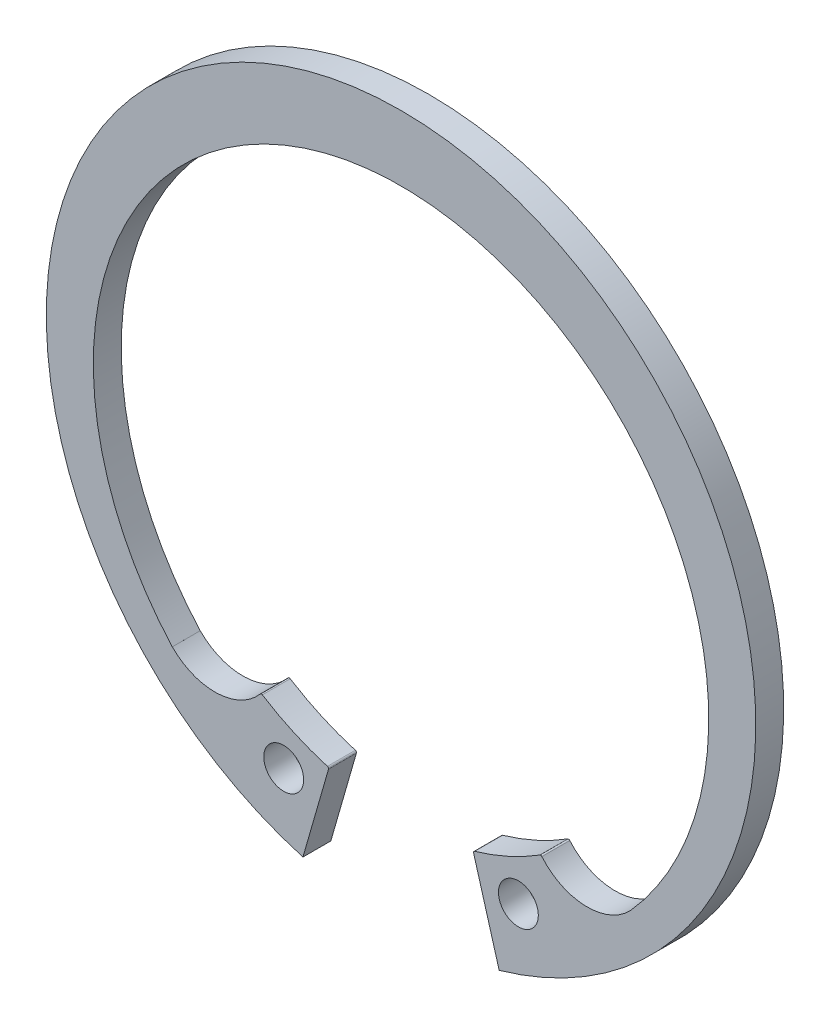
ISO-10303-21;
HEADER;
FILE_DESCRIPTION(('STEP AP214'),'2;1');
FILE_NAME('part.step','',(''),(''),'','','');
FILE_SCHEMA(('AUTOMOTIVE_DESIGN { 1 0 10303 214 1 1 1 1 }'));
ENDSEC;
DATA;
#1=APPLICATION_CONTEXT('core data for automotive mechanical design processes');
#2=APPLICATION_PROTOCOL_DEFINITION('international standard','automotive_design',2000,#1);
#3=PRODUCT_CONTEXT('',#1,'mechanical');
#4=PRODUCT('Part','Part','',(#3));
#5=PRODUCT_RELATED_PRODUCT_CATEGORY('part','',(#4));
#6=PRODUCT_DEFINITION_FORMATION('','',#4);
#7=PRODUCT_DEFINITION_CONTEXT('part definition',#1,'design');
#8=PRODUCT_DEFINITION('design','',#6,#7);
#9=PRODUCT_DEFINITION_SHAPE('','',#8);
#10=(LENGTH_UNIT() NAMED_UNIT(*) SI_UNIT(.MILLI.,.METRE.));
#11=(NAMED_UNIT(*) PLANE_ANGLE_UNIT() SI_UNIT($,.RADIAN.));
#12=(NAMED_UNIT(*) SI_UNIT($,.STERADIAN.) SOLID_ANGLE_UNIT());
#13=UNCERTAINTY_MEASURE_WITH_UNIT(LENGTH_MEASURE(1.E-05),#10,'distance_accuracy_value','');
#14=(GEOMETRIC_REPRESENTATION_CONTEXT(3) GLOBAL_UNCERTAINTY_ASSIGNED_CONTEXT((#13)) GLOBAL_UNIT_ASSIGNED_CONTEXT((#10,
#11,#12)) REPRESENTATION_CONTEXT('',''));
#15=CARTESIAN_POINT('',(0.,0.,0.));
#16=DIRECTION('',(0.,0.,1.));
#17=DIRECTION('',(1.,0.,0.));
#18=AXIS2_PLACEMENT_3D('',#15,#16,#17);
#19=CARTESIAN_POINT('',(0.,0.,-1.75));
#20=DIRECTION('',(0.,0.,1.));
#21=DIRECTION('',(1.,0.,0.));
#22=AXIS2_PLACEMENT_3D('',#19,#20,#21);
#23=CYLINDRICAL_SURFACE('',#22,22.25);
#24=CARTESIAN_POINT('',(0.,0.,-1.75));
#25=DIRECTION('',(0.,0.,1.));
#26=DIRECTION('',(1.,0.,0.));
#27=AXIS2_PLACEMENT_3D('',#24,#25,#26);
#28=CIRCLE('',#27,22.25);
#29=CARTESIAN_POINT('',(6.15473831044329,-21.3818076020238,-1.75));
#30=VERTEX_POINT('',#29);
#31=CARTESIAN_POINT('',(-6.15473831044329,-21.3818076020238,-1.75));
#32=VERTEX_POINT('',#31);
#33=EDGE_CURVE('E48',#30,#32,#28,.T.);
#34=ORIENTED_EDGE('',*,*,#33,.T.);
#35=DIRECTION('',(0.,0.,1.));
#36=VECTOR('',#35,1.);
#37=CARTESIAN_POINT('',(-6.15473831044329,-21.3818076020238,-1.75));
#38=LINE('',#37,#36);
#39=CARTESIAN_POINT('',(-6.15473831044329,-21.3818076020238,0.));
#40=VERTEX_POINT('',#39);
#41=EDGE_CURVE('E35',#32,#40,#38,.T.);
#42=ORIENTED_EDGE('',*,*,#41,.T.);
#43=CARTESIAN_POINT('',(0.,0.,0.));
#44=DIRECTION('',(0.,0.,1.));
#45=DIRECTION('',(1.,0.,0.));
#46=AXIS2_PLACEMENT_3D('',#43,#44,#45);
#47=CIRCLE('',#46,22.25);
#48=CARTESIAN_POINT('',(6.15473831044329,-21.3818076020238,0.));
#49=VERTEX_POINT('',#48);
#50=EDGE_CURVE('E137',#49,#40,#47,.T.);
#51=ORIENTED_EDGE('',*,*,#50,.F.);
#52=DIRECTION('',(0.,0.,1.));
#53=VECTOR('',#52,1.);
#54=CARTESIAN_POINT('',(6.15473831044329,-21.3818076020238,-1.75));
#55=LINE('',#54,#53);
#56=EDGE_CURVE('E11',#30,#49,#55,.T.);
#57=ORIENTED_EDGE('',*,*,#56,.F.);
#58=EDGE_LOOP('',(#34,#42,#51,#57));
#59=FACE_BOUND('',#58,.T.);
#60=ADVANCED_FACE('F32',(#59),#23,.T.);
#61=CARTESIAN_POINT('',(6.15473831044329,-21.3818076020238,-1.75));
#62=DIRECTION('',(-0.960980116944889,-0.276617452154754,0.));
#63=DIRECTION('',(0.276617452154754,-0.960980116944889,0.));
#64=AXIS2_PLACEMENT_3D('',#61,#62,#63);
#65=PLANE('',#64);
#66=DIRECTION('',(0.276617452154754,-0.960980116944889,0.));
#67=VECTOR('',#66,1.);
#68=CARTESIAN_POINT('',(6.15473831044329,-21.3818076020238,0.));
#69=LINE('',#68,#67);
#70=CARTESIAN_POINT('',(4.55027300891599,-15.8078308298239,0.));
#71=VERTEX_POINT('',#70);
#72=EDGE_CURVE('E245',#71,#49,#69,.T.);
#73=ORIENTED_EDGE('',*,*,#72,.F.);
#74=DIRECTION('',(0.,0.,1.));
#75=VECTOR('',#74,1.);
#76=CARTESIAN_POINT('',(4.55027300891599,-15.8078308298239,-1.75));
#77=LINE('',#76,#75);
#78=CARTESIAN_POINT('',(4.55027300891599,-15.8078308298239,-1.75));
#79=VERTEX_POINT('',#78);
#80=EDGE_CURVE('E215',#79,#71,#77,.T.);
#81=ORIENTED_EDGE('',*,*,#80,.F.);
#82=DIRECTION('',(0.276617452154754,-0.960980116944889,0.));
#83=VECTOR('',#82,1.);
#84=CARTESIAN_POINT('',(6.15473831044329,-21.3818076020238,-1.75));
#85=LINE('',#84,#83);
#86=EDGE_CURVE('E251',#79,#30,#85,.T.);
#87=ORIENTED_EDGE('',*,*,#86,.T.);
#88=ORIENTED_EDGE('',*,*,#56,.T.);
#89=EDGE_LOOP('',(#73,#81,#87,#88));
#90=FACE_BOUND('',#89,.T.);
#91=ADVANCED_FACE('F300',(#90),#65,.T.);
#92=CARTESIAN_POINT('',(0.,-1.15100936737794,-1.75));
#93=DIRECTION('',(0.,0.,1.));
#94=DIRECTION('',(1.,0.,0.));
#95=AXIS2_PLACEMENT_3D('',#92,#93,#94);
#96=CYLINDRICAL_SURFACE('',#95,19.3010093673779);
#97=DIRECTION('',(0.,0.,1.));
#98=VECTOR('',#97,1.);
#99=CARTESIAN_POINT('',(-14.3481426053221,-14.0606866048984,-1.75));
#100=LINE('',#99,#98);
#101=CARTESIAN_POINT('',(-14.3481426053221,-14.0606866048984,-1.75));
#102=VERTEX_POINT('',#101);
#103=CARTESIAN_POINT('',(-14.3481426053221,-14.0606866048984,0.));
#104=VERTEX_POINT('',#103);
#105=EDGE_CURVE('E180',#102,#104,#100,.T.);
#106=ORIENTED_EDGE('',*,*,#105,.F.);
#107=CARTESIAN_POINT('',(0.,-1.15100936737794,-1.75));
#108=DIRECTION('',(0.,0.,-1.));
#109=DIRECTION('',(1.,0.,0.));
#110=AXIS2_PLACEMENT_3D('',#107,#108,#109);
#111=CIRCLE('',#110,19.3010093673779);
#112=CARTESIAN_POINT('',(14.3481426053221,-14.0606866048984,-1.75));
#113=VERTEX_POINT('',#112);
#114=EDGE_CURVE('E249',#102,#113,#111,.T.);
#115=ORIENTED_EDGE('',*,*,#114,.T.);
#116=DIRECTION('',(0.,0.,1.));
#117=VECTOR('',#116,1.);
#118=CARTESIAN_POINT('',(14.3481426053221,-14.0606866048984,-1.75));
#119=LINE('',#118,#117);
#120=CARTESIAN_POINT('',(14.3481426053221,-14.0606866048984,0.));
#121=VERTEX_POINT('',#120);
#122=EDGE_CURVE('E218',#121,#113,#119,.F.);
#123=ORIENTED_EDGE('',*,*,#122,.F.);
#124=CARTESIAN_POINT('',(0.,-1.15100936737794,0.));
#125=DIRECTION('',(0.,0.,-1.));
#126=DIRECTION('',(1.,0.,0.));
#127=AXIS2_PLACEMENT_3D('',#124,#125,#126);
#128=CIRCLE('',#127,19.3010093673779);
#129=EDGE_CURVE('E139',#104,#121,#128,.T.);
#130=ORIENTED_EDGE('',*,*,#129,.F.);
#131=EDGE_LOOP('',(#106,#115,#123,#130));
#132=FACE_BOUND('',#131,.T.);
#133=ADVANCED_FACE('F279',(#132),#96,.F.);
#134=CARTESIAN_POINT('',(-6.15473831044329,-21.3818076020238,-1.75));
#135=DIRECTION('',(0.960980116944889,-0.276617452154755,0.));
#136=DIRECTION('',(0.276617452154755,0.960980116944889,0.));
#137=AXIS2_PLACEMENT_3D('',#134,#135,#136);
#138=PLANE('',#137);
#139=DIRECTION('',(0.276617452154755,0.960980116944889,0.));
#140=VECTOR('',#139,1.);
#141=CARTESIAN_POINT('',(-6.15473831044329,-21.3818076020238,0.));
#142=LINE('',#141,#140);
#143=CARTESIAN_POINT('',(-4.55027300891599,-15.8078308298239,0.));
#144=VERTEX_POINT('',#143);
#145=EDGE_CURVE('E129',#40,#144,#142,.T.);
#146=ORIENTED_EDGE('',*,*,#145,.F.);
#147=ORIENTED_EDGE('',*,*,#41,.F.);
#148=DIRECTION('',(0.276617452154755,0.960980116944889,0.));
#149=VECTOR('',#148,1.);
#150=CARTESIAN_POINT('',(-6.15473831044329,-21.3818076020238,-1.75));
#151=LINE('',#150,#149);
#152=CARTESIAN_POINT('',(-4.55027300891599,-15.8078308298239,-1.75));
#153=VERTEX_POINT('',#152);
#154=EDGE_CURVE('E145',#32,#153,#151,.T.);
#155=ORIENTED_EDGE('',*,*,#154,.T.);
#156=DIRECTION('',(0.,0.,1.));
#157=VECTOR('',#156,1.);
#158=CARTESIAN_POINT('',(-4.55027300891599,-15.8078308298239,-1.75));
#159=LINE('',#158,#157);
#160=EDGE_CURVE('E142',#153,#144,#159,.T.);
#161=ORIENTED_EDGE('',*,*,#160,.T.);
#162=EDGE_LOOP('',(#146,#147,#155,#161));
#163=FACE_BOUND('',#162,.T.);
#164=ADVANCED_FACE('F143',(#163),#138,.T.);
#165=CARTESIAN_POINT('',(0.,0.,-1.75));
#166=DIRECTION('',(0.,0.,1.));
#167=DIRECTION('',(1.,0.,0.));
#168=AXIS2_PLACEMENT_3D('',#165,#166,#167);
#169=PLANE('',#168);
#170=ORIENTED_EDGE('',*,*,#114,.F.);
#171=DIRECTION('',(-0.714225110552972,-0.699916060292658,0.));
#172=VECTOR('',#171,1.);
#173=CARTESIAN_POINT('',(-15.8915087098036,-15.5731323415116,-1.75));
#174=LINE('',#173,#172);
#175=CARTESIAN_POINT('',(-14.3451372472455,-14.057741457278,-1.75));
#176=VERTEX_POINT('',#175);
#177=EDGE_CURVE('E150',#176,#102,#174,.T.);
#178=ORIENTED_EDGE('',*,*,#177,.F.);
#179=CARTESIAN_POINT('',(-11.6775805575411,-11.4436275857849,-1.75));
#180=DIRECTION('',(0.,0.,-1.));
#181=DIRECTION('',(1.,0.,0.));
#182=AXIS2_PLACEMENT_3D('',#179,#180,#181);
#183=CIRCLE('',#182,3.73489625370228);
#184=CARTESIAN_POINT('',(-8.83127616096119,-13.8618916962429,-1.75));
#185=VERTEX_POINT('',#184);
#186=EDGE_CURVE('E174',#185,#176,#183,.T.);
#187=ORIENTED_EDGE('',*,*,#186,.F.);
#188=CARTESIAN_POINT('',(-8.75506776845876,-13.9266395217832,-1.75));
#189=DIRECTION('',(0.,0.,1.));
#190=DIRECTION('',(1.,0.,0.));
#191=AXIS2_PLACEMENT_3D('',#188,#189,#190);
#192=CIRCLE('',#191,0.1);
#193=CARTESIAN_POINT('',(-8.70184547199397,-13.8419790991584,-1.75));
#194=VERTEX_POINT('',#193);
#195=EDGE_CURVE('E171',#194,#185,#192,.T.);
#196=ORIENTED_EDGE('',*,*,#195,.F.);
#197=CARTESIAN_POINT('',(0.,0.,-1.75));
#198=DIRECTION('',(0.,0.,-1.));
#199=DIRECTION('',(1.,0.,0.));
#200=AXIS2_PLACEMENT_3D('',#197,#198,#199);
#201=CIRCLE('',#200,16.35);
#202=CARTESIAN_POINT('',(-4.61812560407181,-15.6842410050667,-1.75));
#203=VERTEX_POINT('',#202);
#204=EDGE_CURVE('E169',#203,#194,#201,.T.);
#205=ORIENTED_EDGE('',*,*,#204,.F.);
#206=CARTESIAN_POINT('',(-4.64637102061048,-15.7801690846084,-1.75));
#207=DIRECTION('',(0.,0.,1.));
#208=DIRECTION('',(-1.,0.,0.));
#209=AXIS2_PLACEMENT_3D('',#206,#207,#208);
#210=CIRCLE('',#209,0.0999999999999959);
#211=EDGE_CURVE('E167',#153,#203,#210,.T.);
#212=ORIENTED_EDGE('',*,*,#211,.F.);
#213=ORIENTED_EDGE('',*,*,#154,.F.);
#214=ORIENTED_EDGE('',*,*,#33,.F.);
#215=ORIENTED_EDGE('',*,*,#86,.F.);
#216=CARTESIAN_POINT('',(4.64637102061048,-15.7801690846084,-1.75));
#217=DIRECTION('',(0.,0.,1.));
#218=DIRECTION('',(1.,0.,0.));
#219=AXIS2_PLACEMENT_3D('',#216,#217,#218);
#220=CIRCLE('',#219,0.0999999999999972);
#221=CARTESIAN_POINT('',(4.61812560407181,-15.6842410050667,-1.75));
#222=VERTEX_POINT('',#221);
#223=EDGE_CURVE('E211',#222,#79,#220,.T.);
#224=ORIENTED_EDGE('',*,*,#223,.F.);
#225=CARTESIAN_POINT('',(0.,0.,-1.75));
#226=DIRECTION('',(0.,0.,-1.));
#227=DIRECTION('',(1.,0.,0.));
#228=AXIS2_PLACEMENT_3D('',#225,#226,#227);
#229=CIRCLE('',#228,16.35);
#230=CARTESIAN_POINT('',(8.70184547199397,-13.8419790991584,-1.75));
#231=VERTEX_POINT('',#230);
#232=EDGE_CURVE('E209',#231,#222,#229,.T.);
#233=ORIENTED_EDGE('',*,*,#232,.F.);
#234=CARTESIAN_POINT('',(8.75506776845876,-13.9266395217832,-1.75));
#235=DIRECTION('',(0.,0.,1.));
#236=DIRECTION('',(-1.,0.,0.));
#237=AXIS2_PLACEMENT_3D('',#234,#235,#236);
#238=CIRCLE('',#237,0.1);
#239=CARTESIAN_POINT('',(8.83127616096119,-13.8618916962429,-1.75));
#240=VERTEX_POINT('',#239);
#241=EDGE_CURVE('E206',#240,#231,#238,.T.);
#242=ORIENTED_EDGE('',*,*,#241,.F.);
#243=CARTESIAN_POINT('',(11.6775805575411,-11.4436275857849,-1.75));
#244=DIRECTION('',(0.,0.,-1.));
#245=DIRECTION('',(1.,0.,0.));
#246=AXIS2_PLACEMENT_3D('',#243,#244,#245);
#247=CIRCLE('',#246,3.73489625370228);
#248=CARTESIAN_POINT('',(14.3451372472455,-14.057741457278,-1.75));
#249=VERTEX_POINT('',#248);
#250=EDGE_CURVE('E203',#249,#240,#247,.T.);
#251=ORIENTED_EDGE('',*,*,#250,.F.);
#252=DIRECTION('',(-0.714225110552972,0.699916060292658,0.));
#253=VECTOR('',#252,1.);
#254=CARTESIAN_POINT('',(14.3451372472455,-14.057741457278,-1.75));
#255=LINE('',#254,#253);
#256=EDGE_CURVE('E201',#113,#249,#255,.T.);
#257=ORIENTED_EDGE('',*,*,#256,.F.);
#258=EDGE_LOOP('',(#170,#178,#187,#196,#205,#212,#213,#214,#215,#224,#233,#242,#251,#257));
#259=FACE_BOUND('',#258,.T.);
#260=CARTESIAN_POINT('',(7.35991880160462,-17.163543347275,-1.75));
#261=DIRECTION('',(0.,0.,1.));
#262=DIRECTION('',(1.,0.,0.));
#263=AXIS2_PLACEMENT_3D('',#260,#261,#262);
#264=CIRCLE('',#263,1.25);
#265=CARTESIAN_POINT('',(8.60991880160462,-17.163543347275,-1.75));
#266=VERTEX_POINT('',#265);
#267=EDGE_CURVE('E240',#266,#266,#264,.T.);
#268=ORIENTED_EDGE('',*,*,#267,.T.);
#269=EDGE_LOOP('',(#268));
#270=FACE_BOUND('',#269,.T.);
#271=CARTESIAN_POINT('',(-7.35991880160461,-17.163543347275,-1.75));
#272=DIRECTION('',(0.,0.,1.));
#273=DIRECTION('',(1.,0.,0.));
#274=AXIS2_PLACEMENT_3D('',#271,#272,#273);
#275=CIRCLE('',#274,1.25);
#276=CARTESIAN_POINT('',(-6.10991880160461,-17.163543347275,-1.75));
#277=VERTEX_POINT('',#276);
#278=EDGE_CURVE('E234',#277,#277,#275,.T.);
#279=ORIENTED_EDGE('',*,*,#278,.T.);
#280=EDGE_LOOP('',(#279));
#281=FACE_BOUND('',#280,.T.);
#282=ADVANCED_FACE('F257',(#259,#270,#281),#169,.F.);
#283=CARTESIAN_POINT('',(0.,0.,0.));
#284=DIRECTION('',(0.,0.,1.));
#285=DIRECTION('',(1.,0.,0.));
#286=AXIS2_PLACEMENT_3D('',#283,#284,#285);
#287=PLANE('',#286);
#288=DIRECTION('',(-0.714225110552972,-0.699916060292658,0.));
#289=VECTOR('',#288,1.);
#290=CARTESIAN_POINT('',(-15.8915087098036,-15.5731323415116,0.));
#291=LINE('',#290,#289);
#292=CARTESIAN_POINT('',(-14.3451372472455,-14.057741457278,0.));
#293=VERTEX_POINT('',#292);
#294=EDGE_CURVE('E165',#293,#104,#291,.T.);
#295=ORIENTED_EDGE('',*,*,#294,.T.);
#296=ORIENTED_EDGE('',*,*,#129,.T.);
#297=DIRECTION('',(-0.714225110552972,0.699916060292658,0.));
#298=VECTOR('',#297,1.);
#299=CARTESIAN_POINT('',(14.3451372472455,-14.057741457278,0.));
#300=LINE('',#299,#298);
#301=CARTESIAN_POINT('',(14.3451372472455,-14.057741457278,0.));
#302=VERTEX_POINT('',#301);
#303=EDGE_CURVE('E188',#121,#302,#300,.T.);
#304=ORIENTED_EDGE('',*,*,#303,.T.);
#305=CARTESIAN_POINT('',(11.6775805575411,-11.4436275857849,0.));
#306=DIRECTION('',(0.,0.,-1.));
#307=DIRECTION('',(1.,0.,0.));
#308=AXIS2_PLACEMENT_3D('',#305,#306,#307);
#309=CIRCLE('',#308,3.73489625370228);
#310=CARTESIAN_POINT('',(8.83127616096119,-13.8618916962429,0.));
#311=VERTEX_POINT('',#310);
#312=EDGE_CURVE('E190',#302,#311,#309,.T.);
#313=ORIENTED_EDGE('',*,*,#312,.T.);
#314=CARTESIAN_POINT('',(8.75506776845876,-13.9266395217832,0.));
#315=DIRECTION('',(0.,0.,1.));
#316=DIRECTION('',(-1.,0.,0.));
#317=AXIS2_PLACEMENT_3D('',#314,#315,#316);
#318=CIRCLE('',#317,0.1);
#319=CARTESIAN_POINT('',(8.70184547199397,-13.8419790991584,0.));
#320=VERTEX_POINT('',#319);
#321=EDGE_CURVE('E193',#311,#320,#318,.T.);
#322=ORIENTED_EDGE('',*,*,#321,.T.);
#323=CARTESIAN_POINT('',(0.,0.,0.));
#324=DIRECTION('',(0.,0.,-1.));
#325=DIRECTION('',(1.,0.,0.));
#326=AXIS2_PLACEMENT_3D('',#323,#324,#325);
#327=CIRCLE('',#326,16.35);
#328=CARTESIAN_POINT('',(4.61812560407181,-15.6842410050667,0.));
#329=VERTEX_POINT('',#328);
#330=EDGE_CURVE('E196',#320,#329,#327,.T.);
#331=ORIENTED_EDGE('',*,*,#330,.T.);
#332=CARTESIAN_POINT('',(4.64637102061048,-15.7801690846084,0.));
#333=DIRECTION('',(0.,0.,1.));
#334=DIRECTION('',(1.,0.,0.));
#335=AXIS2_PLACEMENT_3D('',#332,#333,#334);
#336=CIRCLE('',#335,0.0999999999999972);
#337=EDGE_CURVE('E198',#329,#71,#336,.T.);
#338=ORIENTED_EDGE('',*,*,#337,.T.);
#339=ORIENTED_EDGE('',*,*,#72,.T.);
#340=ORIENTED_EDGE('',*,*,#50,.T.);
#341=ORIENTED_EDGE('',*,*,#145,.T.);
#342=CARTESIAN_POINT('',(-4.64637102061048,-15.7801690846084,0.));
#343=DIRECTION('',(0.,0.,1.));
#344=DIRECTION('',(-1.,0.,0.));
#345=AXIS2_PLACEMENT_3D('',#342,#343,#344);
#346=CIRCLE('',#345,0.0999999999999959);
#347=CARTESIAN_POINT('',(-4.61812560407181,-15.6842410050667,0.));
#348=VERTEX_POINT('',#347);
#349=EDGE_CURVE('E135',#144,#348,#346,.T.);
#350=ORIENTED_EDGE('',*,*,#349,.T.);
#351=CARTESIAN_POINT('',(0.,0.,0.));
#352=DIRECTION('',(0.,0.,-1.));
#353=DIRECTION('',(1.,0.,0.));
#354=AXIS2_PLACEMENT_3D('',#351,#352,#353);
#355=CIRCLE('',#354,16.35);
#356=CARTESIAN_POINT('',(-8.70184547199397,-13.8419790991584,0.));
#357=VERTEX_POINT('',#356);
#358=EDGE_CURVE('E155',#348,#357,#355,.T.);
#359=ORIENTED_EDGE('',*,*,#358,.T.);
#360=CARTESIAN_POINT('',(-8.75506776845876,-13.9266395217832,0.));
#361=DIRECTION('',(0.,0.,1.));
#362=DIRECTION('',(1.,0.,0.));
#363=AXIS2_PLACEMENT_3D('',#360,#361,#362);
#364=CIRCLE('',#363,0.1);
#365=CARTESIAN_POINT('',(-8.83127616096119,-13.8618916962429,0.));
#366=VERTEX_POINT('',#365);
#367=EDGE_CURVE('E157',#357,#366,#364,.T.);
#368=ORIENTED_EDGE('',*,*,#367,.T.);
#369=CARTESIAN_POINT('',(-11.6775805575411,-11.4436275857849,0.));
#370=DIRECTION('',(0.,0.,-1.));
#371=DIRECTION('',(1.,0.,0.));
#372=AXIS2_PLACEMENT_3D('',#369,#370,#371);
#373=CIRCLE('',#372,3.73489625370228);
#374=EDGE_CURVE('E162',#366,#293,#373,.T.);
#375=ORIENTED_EDGE('',*,*,#374,.T.);
#376=EDGE_LOOP('',(#295,#296,#304,#313,#322,#331,#338,#339,#340,#341,#350,#359,#368,#375));
#377=FACE_BOUND('',#376,.T.);
#378=CARTESIAN_POINT('',(7.35991880160462,-17.163543347275,0.));
#379=DIRECTION('',(0.,0.,1.));
#380=DIRECTION('',(1.,0.,0.));
#381=AXIS2_PLACEMENT_3D('',#378,#379,#380);
#382=CIRCLE('',#381,1.25);
#383=CARTESIAN_POINT('',(8.60991880160462,-17.163543347275,0.));
#384=VERTEX_POINT('',#383);
#385=EDGE_CURVE('E237',#384,#384,#382,.T.);
#386=ORIENTED_EDGE('',*,*,#385,.F.);
#387=EDGE_LOOP('',(#386));
#388=FACE_BOUND('',#387,.T.);
#389=CARTESIAN_POINT('',(-7.35991880160461,-17.163543347275,0.));
#390=DIRECTION('',(0.,0.,1.));
#391=DIRECTION('',(1.,0.,0.));
#392=AXIS2_PLACEMENT_3D('',#389,#390,#391);
#393=CIRCLE('',#392,1.25);
#394=CARTESIAN_POINT('',(-6.10991880160461,-17.163543347275,0.));
#395=VERTEX_POINT('',#394);
#396=EDGE_CURVE('E231',#395,#395,#393,.T.);
#397=ORIENTED_EDGE('',*,*,#396,.F.);
#398=EDGE_LOOP('',(#397));
#399=FACE_BOUND('',#398,.T.);
#400=ADVANCED_FACE('F132',(#377,#388,#399),#287,.T.);
#401=CARTESIAN_POINT('',(7.35991880160462,-17.163543347275,-1.75));
#402=DIRECTION('',(0.,0.,1.));
#403=DIRECTION('',(1.,0.,0.));
#404=AXIS2_PLACEMENT_3D('',#401,#402,#403);
#405=CYLINDRICAL_SURFACE('',#404,1.25);
#406=ORIENTED_EDGE('',*,*,#267,.F.);
#407=EDGE_LOOP('',(#406));
#408=FACE_BOUND('',#407,.T.);
#409=ORIENTED_EDGE('',*,*,#385,.T.);
#410=EDGE_LOOP('',(#409));
#411=FACE_BOUND('',#410,.T.);
#412=ADVANCED_FACE('F317',(#408,#411),#405,.F.);
#413=CARTESIAN_POINT('',(-7.35991880160461,-17.163543347275,-1.75));
#414=DIRECTION('',(0.,0.,1.));
#415=DIRECTION('',(1.,0.,0.));
#416=AXIS2_PLACEMENT_3D('',#413,#414,#415);
#417=CYLINDRICAL_SURFACE('',#416,1.25);
#418=ORIENTED_EDGE('',*,*,#278,.F.);
#419=EDGE_LOOP('',(#418));
#420=FACE_BOUND('',#419,.T.);
#421=ORIENTED_EDGE('',*,*,#396,.T.);
#422=EDGE_LOOP('',(#421));
#423=FACE_BOUND('',#422,.T.);
#424=ADVANCED_FACE('F321',(#420,#423),#417,.F.);
#425=CARTESIAN_POINT('',(0.,0.,-1.75));
#426=DIRECTION('',(0.,0.,1.));
#427=DIRECTION('',(1.,0.,0.));
#428=AXIS2_PLACEMENT_3D('',#425,#426,#427);
#429=CYLINDRICAL_SURFACE('',#428,16.35);
#430=ORIENTED_EDGE('',*,*,#330,.F.);
#431=DIRECTION('',(0.,0.,1.));
#432=VECTOR('',#431,1.);
#433=CARTESIAN_POINT('',(8.70184547199397,-13.8419790991584,-1.75));
#434=LINE('',#433,#432);
#435=EDGE_CURVE('E222',#231,#320,#434,.T.);
#436=ORIENTED_EDGE('',*,*,#435,.F.);
#437=ORIENTED_EDGE('',*,*,#232,.T.);
#438=DIRECTION('',(0.,0.,1.));
#439=VECTOR('',#438,1.);
#440=CARTESIAN_POINT('',(4.61812560407181,-15.6842410050667,-1.75));
#441=LINE('',#440,#439);
#442=EDGE_CURVE('E219',#222,#329,#441,.T.);
#443=ORIENTED_EDGE('',*,*,#442,.T.);
#444=EDGE_LOOP('',(#430,#436,#437,#443));
#445=FACE_BOUND('',#444,.T.);
#446=ADVANCED_FACE('F294',(#445),#429,.F.);
#447=CARTESIAN_POINT('',(4.64637102061048,-15.7801690846084,-1.75));
#448=DIRECTION('',(0.,0.,1.));
#449=DIRECTION('',(1.,0.,0.));
#450=AXIS2_PLACEMENT_3D('',#447,#448,#449);
#451=CYLINDRICAL_SURFACE('',#450,0.0999999999999972);
#452=ORIENTED_EDGE('',*,*,#337,.F.);
#453=ORIENTED_EDGE('',*,*,#442,.F.);
#454=ORIENTED_EDGE('',*,*,#223,.T.);
#455=ORIENTED_EDGE('',*,*,#80,.T.);
#456=EDGE_LOOP('',(#452,#453,#454,#455));
#457=FACE_BOUND('',#456,.T.);
#458=ADVANCED_FACE('F299',(#457),#451,.T.);
#459=CARTESIAN_POINT('',(8.75506776845876,-13.9266395217832,-1.75));
#460=DIRECTION('',(0.,0.,1.));
#461=DIRECTION('',(1.,0.,0.));
#462=AXIS2_PLACEMENT_3D('',#459,#460,#461);
#463=CYLINDRICAL_SURFACE('',#462,0.1);
#464=ORIENTED_EDGE('',*,*,#321,.F.);
#465=DIRECTION('',(0.,0.,1.));
#466=VECTOR('',#465,1.);
#467=CARTESIAN_POINT('',(8.83127616096119,-13.8618916962429,-1.75));
#468=LINE('',#467,#466);
#469=EDGE_CURVE('E225',#240,#311,#468,.T.);
#470=ORIENTED_EDGE('',*,*,#469,.F.);
#471=ORIENTED_EDGE('',*,*,#241,.T.);
#472=ORIENTED_EDGE('',*,*,#435,.T.);
#473=EDGE_LOOP('',(#464,#470,#471,#472));
#474=FACE_BOUND('',#473,.T.);
#475=ADVANCED_FACE('F291',(#474),#463,.T.);
#476=CARTESIAN_POINT('',(11.6775805575411,-11.4436275857849,-1.75));
#477=DIRECTION('',(0.,0.,1.));
#478=DIRECTION('',(1.,0.,0.));
#479=AXIS2_PLACEMENT_3D('',#476,#477,#478);
#480=CYLINDRICAL_SURFACE('',#479,3.73489625370228);
#481=ORIENTED_EDGE('',*,*,#312,.F.);
#482=DIRECTION('',(0.,0.,1.));
#483=VECTOR('',#482,1.);
#484=CARTESIAN_POINT('',(14.3451372472455,-14.057741457278,-1.75));
#485=LINE('',#484,#483);
#486=EDGE_CURVE('E214',#249,#302,#485,.T.);
#487=ORIENTED_EDGE('',*,*,#486,.F.);
#488=ORIENTED_EDGE('',*,*,#250,.T.);
#489=ORIENTED_EDGE('',*,*,#469,.T.);
#490=EDGE_LOOP('',(#481,#487,#488,#489));
#491=FACE_BOUND('',#490,.T.);
#492=ADVANCED_FACE('F288',(#491),#480,.F.);
#493=CARTESIAN_POINT('',(14.3451372472455,-14.057741457278,-1.75));
#494=DIRECTION('',(0.699916060292658,0.714225110552972,0.));
#495=DIRECTION('',(-0.714225110552972,0.699916060292658,0.));
#496=AXIS2_PLACEMENT_3D('',#493,#494,#495);
#497=PLANE('',#496);
#498=ORIENTED_EDGE('',*,*,#303,.F.);
#499=ORIENTED_EDGE('',*,*,#122,.T.);
#500=ORIENTED_EDGE('',*,*,#256,.T.);
#501=ORIENTED_EDGE('',*,*,#486,.T.);
#502=EDGE_LOOP('',(#498,#499,#500,#501));
#503=FACE_BOUND('',#502,.T.);
#504=ADVANCED_FACE('F282',(#503),#497,.T.);
#505=CARTESIAN_POINT('',(0.,0.,-1.75));
#506=DIRECTION('',(0.,0.,1.));
#507=DIRECTION('',(1.,0.,0.));
#508=AXIS2_PLACEMENT_3D('',#505,#506,#507);
#509=CYLINDRICAL_SURFACE('',#508,16.35);
#510=ORIENTED_EDGE('',*,*,#358,.F.);
#511=DIRECTION('',(0.,0.,1.));
#512=VECTOR('',#511,1.);
#513=CARTESIAN_POINT('',(-4.61812560407181,-15.6842410050667,-1.75));
#514=LINE('',#513,#512);
#515=EDGE_CURVE('E149',#203,#348,#514,.T.);
#516=ORIENTED_EDGE('',*,*,#515,.F.);
#517=ORIENTED_EDGE('',*,*,#204,.T.);
#518=DIRECTION('',(0.,0.,1.));
#519=VECTOR('',#518,1.);
#520=CARTESIAN_POINT('',(-8.70184547199397,-13.8419790991584,-1.75));
#521=LINE('',#520,#519);
#522=EDGE_CURVE('E183',#194,#357,#521,.T.);
#523=ORIENTED_EDGE('',*,*,#522,.T.);
#524=EDGE_LOOP('',(#510,#516,#517,#523));
#525=FACE_BOUND('',#524,.T.);
#526=ADVANCED_FACE('F263',(#525),#509,.F.);
#527=CARTESIAN_POINT('',(-15.8915087098036,-15.5731323415116,-1.75));
#528=DIRECTION('',(-0.699916060292658,0.714225110552972,0.));
#529=DIRECTION('',(-0.714225110552972,-0.699916060292658,0.));
#530=AXIS2_PLACEMENT_3D('',#527,#528,#529);
#531=PLANE('',#530);
#532=ORIENTED_EDGE('',*,*,#177,.T.);
#533=ORIENTED_EDGE('',*,*,#105,.T.);
#534=ORIENTED_EDGE('',*,*,#294,.F.);
#535=DIRECTION('',(0.,0.,1.));
#536=VECTOR('',#535,1.);
#537=CARTESIAN_POINT('',(-14.3451372472455,-14.057741457278,-1.75));
#538=LINE('',#537,#536);
#539=EDGE_CURVE('E178',#176,#293,#538,.T.);
#540=ORIENTED_EDGE('',*,*,#539,.F.);
#541=EDGE_LOOP('',(#532,#533,#534,#540));
#542=FACE_BOUND('',#541,.T.);
#543=ADVANCED_FACE('F273',(#542),#531,.T.);
#544=CARTESIAN_POINT('',(-11.6775805575411,-11.4436275857849,-1.75));
#545=DIRECTION('',(0.,0.,1.));
#546=DIRECTION('',(1.,0.,0.));
#547=AXIS2_PLACEMENT_3D('',#544,#545,#546);
#548=CYLINDRICAL_SURFACE('',#547,3.73489625370228);
#549=ORIENTED_EDGE('',*,*,#374,.F.);
#550=DIRECTION('',(0.,0.,1.));
#551=VECTOR('',#550,1.);
#552=CARTESIAN_POINT('',(-8.83127616096119,-13.8618916962429,-1.75));
#553=LINE('',#552,#551);
#554=EDGE_CURVE('E181',#185,#366,#553,.T.);
#555=ORIENTED_EDGE('',*,*,#554,.F.);
#556=ORIENTED_EDGE('',*,*,#186,.T.);
#557=ORIENTED_EDGE('',*,*,#539,.T.);
#558=EDGE_LOOP('',(#549,#555,#556,#557));
#559=FACE_BOUND('',#558,.T.);
#560=ADVANCED_FACE('F270',(#559),#548,.F.);
#561=CARTESIAN_POINT('',(-8.75506776845876,-13.9266395217832,-1.75));
#562=DIRECTION('',(0.,0.,1.));
#563=DIRECTION('',(1.,0.,0.));
#564=AXIS2_PLACEMENT_3D('',#561,#562,#563);
#565=CYLINDRICAL_SURFACE('',#564,0.1);
#566=ORIENTED_EDGE('',*,*,#367,.F.);
#567=ORIENTED_EDGE('',*,*,#522,.F.);
#568=ORIENTED_EDGE('',*,*,#195,.T.);
#569=ORIENTED_EDGE('',*,*,#554,.T.);
#570=EDGE_LOOP('',(#566,#567,#568,#569));
#571=FACE_BOUND('',#570,.T.);
#572=ADVANCED_FACE('F268',(#571),#565,.T.);
#573=CARTESIAN_POINT('',(-4.64637102061048,-15.7801690846084,-1.75));
#574=DIRECTION('',(0.,0.,1.));
#575=DIRECTION('',(1.,0.,0.));
#576=AXIS2_PLACEMENT_3D('',#573,#574,#575);
#577=CYLINDRICAL_SURFACE('',#576,0.0999999999999959);
#578=ORIENTED_EDGE('',*,*,#349,.F.);
#579=ORIENTED_EDGE('',*,*,#160,.F.);
#580=ORIENTED_EDGE('',*,*,#211,.T.);
#581=ORIENTED_EDGE('',*,*,#515,.T.);
#582=EDGE_LOOP('',(#578,#579,#580,#581));
#583=FACE_BOUND('',#582,.T.);
#584=ADVANCED_FACE('F153',(#583),#577,.T.);
#585=CLOSED_SHELL('',(#60,#91,#133,#164,#282,#400,#412,#424,#446,#458,#475,#492,#504,#526,#543,
#560,#572,#584));
#586=MANIFOLD_SOLID_BREP('B2',#585);
#587=ADVANCED_BREP_SHAPE_REPRESENTATION('',(#18,#586),#14);
#588=SHAPE_DEFINITION_REPRESENTATION(#9,#587);
ENDSEC;
END-ISO-10303-21;
